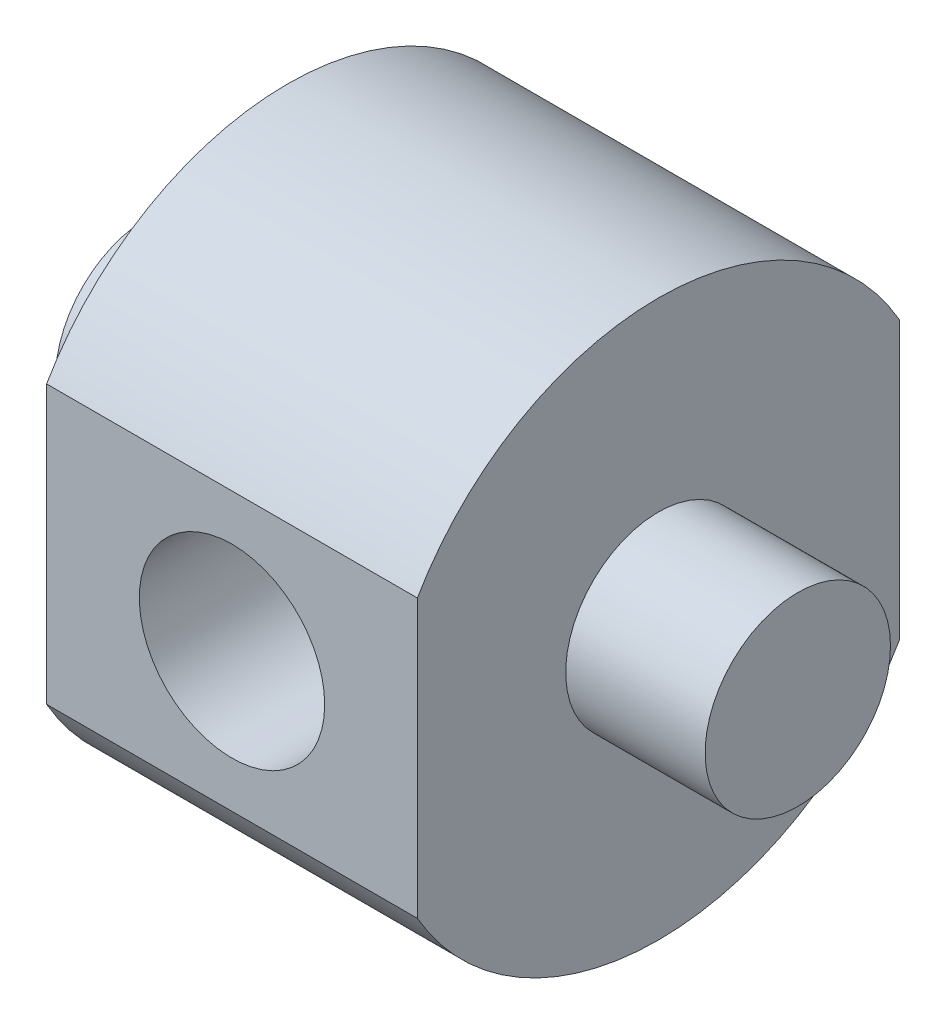
ISO-10303-21;
HEADER;
FILE_DESCRIPTION(('STEP AP214'),'2;1');
FILE_NAME('part.step','',(''),(''),'','','');
FILE_SCHEMA(('AUTOMOTIVE_DESIGN { 1 0 10303 214 1 1 1 1 }'));
ENDSEC;
DATA;
#1=APPLICATION_CONTEXT('core data for automotive mechanical design processes');
#2=APPLICATION_PROTOCOL_DEFINITION('international standard','automotive_design',2000,#1);
#3=PRODUCT_CONTEXT('',#1,'mechanical');
#4=PRODUCT('Part','Part','',(#3));
#5=PRODUCT_RELATED_PRODUCT_CATEGORY('part','',(#4));
#6=PRODUCT_DEFINITION_FORMATION('','',#4);
#7=PRODUCT_DEFINITION_CONTEXT('part definition',#1,'design');
#8=PRODUCT_DEFINITION('design','',#6,#7);
#9=PRODUCT_DEFINITION_SHAPE('','',#8);
#10=(LENGTH_UNIT() NAMED_UNIT(*) SI_UNIT(.MILLI.,.METRE.));
#11=(NAMED_UNIT(*) PLANE_ANGLE_UNIT() SI_UNIT($,.RADIAN.));
#12=(NAMED_UNIT(*) SI_UNIT($,.STERADIAN.) SOLID_ANGLE_UNIT());
#13=UNCERTAINTY_MEASURE_WITH_UNIT(LENGTH_MEASURE(1.E-05),#10,'distance_accuracy_value','');
#14=(GEOMETRIC_REPRESENTATION_CONTEXT(3) GLOBAL_UNCERTAINTY_ASSIGNED_CONTEXT((#13)) GLOBAL_UNIT_ASSIGNED_CONTEXT((#10,
#11,#12)) REPRESENTATION_CONTEXT('',''));
#15=CARTESIAN_POINT('',(0.,0.,0.));
#16=DIRECTION('',(0.,0.,1.));
#17=DIRECTION('',(1.,0.,0.));
#18=AXIS2_PLACEMENT_3D('',#15,#16,#17);
#19=CARTESIAN_POINT('',(6.35,0.,0.));
#20=DIRECTION('',(-1.,0.,0.));
#21=DIRECTION('',(0.,0.,1.));
#22=AXIS2_PLACEMENT_3D('',#19,#20,#21);
#23=CYLINDRICAL_SURFACE('',#22,9.525);
#24=CARTESIAN_POINT('',(6.35,0.,0.));
#25=DIRECTION('',(1.,0.,0.));
#26=DIRECTION('',(0.,0.,-1.));
#27=AXIS2_PLACEMENT_3D('',#24,#25,#26);
#28=CIRCLE('',#27,9.525);
#29=CARTESIAN_POINT('',(6.35,-4.7519048812029,8.255));
#30=VERTEX_POINT('',#29);
#31=CARTESIAN_POINT('',(6.35,-4.75190488120291,-8.255));
#32=VERTEX_POINT('',#31);
#33=EDGE_CURVE('E100',#30,#32,#28,.T.);
#34=ORIENTED_EDGE('',*,*,#33,.F.);
#35=DIRECTION('',(-1.,0.,0.));
#36=VECTOR('',#35,1.);
#37=CARTESIAN_POINT('',(6.35,-4.7519048812029,8.255));
#38=LINE('',#37,#36);
#39=CARTESIAN_POINT('',(-6.35,-4.7519048812029,8.255));
#40=VERTEX_POINT('',#39);
#41=EDGE_CURVE('E127',#30,#40,#38,.T.);
#42=ORIENTED_EDGE('',*,*,#41,.T.);
#43=CARTESIAN_POINT('',(-6.35,0.,0.));
#44=DIRECTION('',(1.,0.,0.));
#45=DIRECTION('',(0.,0.,-1.));
#46=AXIS2_PLACEMENT_3D('',#43,#44,#45);
#47=CIRCLE('',#46,9.525);
#48=CARTESIAN_POINT('',(-6.35,-4.75190488120291,-8.255));
#49=VERTEX_POINT('',#48);
#50=EDGE_CURVE('E101',#40,#49,#47,.T.);
#51=ORIENTED_EDGE('',*,*,#50,.T.);
#52=DIRECTION('',(-1.,0.,0.));
#53=VECTOR('',#52,1.);
#54=CARTESIAN_POINT('',(6.35,-4.75190488120291,-8.255));
#55=LINE('',#54,#53);
#56=EDGE_CURVE('E56',#49,#32,#55,.F.);
#57=ORIENTED_EDGE('',*,*,#56,.T.);
#58=EDGE_LOOP('',(#34,#42,#51,#57));
#59=FACE_BOUND('',#58,.T.);
#60=ADVANCED_FACE('F39',(#59),#23,.T.);
#61=CARTESIAN_POINT('',(-6.35,4.75190488120291,-8.255));
#62=VERTEX_POINT('',#61);
#63=CARTESIAN_POINT('',(-6.35,4.7519048812029,8.255));
#64=VERTEX_POINT('',#63);
#65=EDGE_CURVE('E92',#62,#64,#47,.T.);
#66=ORIENTED_EDGE('',*,*,#65,.T.);
#67=DIRECTION('',(-1.,0.,0.));
#68=VECTOR('',#67,1.);
#69=CARTESIAN_POINT('',(6.35,4.7519048812029,8.255));
#70=LINE('',#69,#68);
#71=CARTESIAN_POINT('',(6.35,4.7519048812029,8.255));
#72=VERTEX_POINT('',#71);
#73=EDGE_CURVE('E64',#64,#72,#70,.F.);
#74=ORIENTED_EDGE('',*,*,#73,.T.);
#75=CARTESIAN_POINT('',(6.35,4.75190488120291,-8.255));
#76=VERTEX_POINT('',#75);
#77=EDGE_CURVE('E94',#76,#72,#28,.T.);
#78=ORIENTED_EDGE('',*,*,#77,.F.);
#79=DIRECTION('',(-1.,0.,0.));
#80=VECTOR('',#79,1.);
#81=CARTESIAN_POINT('',(6.35,4.75190488120291,-8.255));
#82=LINE('',#81,#80);
#83=EDGE_CURVE('E80',#76,#62,#82,.T.);
#84=ORIENTED_EDGE('',*,*,#83,.T.);
#85=EDGE_LOOP('',(#66,#74,#78,#84));
#86=FACE_BOUND('',#85,.T.);
#87=ADVANCED_FACE('F41',(#86),#23,.T.);
#88=CARTESIAN_POINT('',(6.35,0.,0.));
#89=DIRECTION('',(1.,0.,0.));
#90=DIRECTION('',(0.,0.,-1.));
#91=AXIS2_PLACEMENT_3D('',#88,#89,#90);
#92=PLANE('',#91);
#93=DIRECTION('',(0.,1.,0.));
#94=VECTOR('',#93,1.);
#95=CARTESIAN_POINT('',(6.35,0.,8.255));
#96=LINE('',#95,#94);
#97=EDGE_CURVE('E121',#30,#72,#96,.T.);
#98=ORIENTED_EDGE('',*,*,#97,.F.);
#99=ORIENTED_EDGE('',*,*,#33,.T.);
#100=DIRECTION('',(0.,-1.,0.));
#101=VECTOR('',#100,1.);
#102=CARTESIAN_POINT('',(6.35,0.,-8.255));
#103=LINE('',#102,#101);
#104=EDGE_CURVE('E96',#76,#32,#103,.T.);
#105=ORIENTED_EDGE('',*,*,#104,.F.);
#106=ORIENTED_EDGE('',*,*,#77,.T.);
#107=EDGE_LOOP('',(#98,#99,#105,#106));
#108=FACE_BOUND('',#107,.T.);
#109=CARTESIAN_POINT('',(6.35,0.,0.));
#110=DIRECTION('',(1.,0.,0.));
#111=DIRECTION('',(0.,0.,-1.));
#112=AXIS2_PLACEMENT_3D('',#109,#110,#111);
#113=CIRCLE('',#112,3.175);
#114=CARTESIAN_POINT('',(6.35,0.,-3.175));
#115=VERTEX_POINT('',#114);
#116=EDGE_CURVE('E87',#115,#115,#113,.T.);
#117=ORIENTED_EDGE('',*,*,#116,.F.);
#118=EDGE_LOOP('',(#117));
#119=FACE_BOUND('',#118,.T.);
#120=ADVANCED_FACE('F161',(#108,#119),#92,.T.);
#121=CARTESIAN_POINT('',(-6.35,0.,0.));
#122=DIRECTION('',(1.,0.,0.));
#123=DIRECTION('',(0.,0.,-1.));
#124=AXIS2_PLACEMENT_3D('',#121,#122,#123);
#125=PLANE('',#124);
#126=CARTESIAN_POINT('',(-6.35,0.,0.));
#127=DIRECTION('',(1.,0.,0.));
#128=DIRECTION('',(0.,0.,-1.));
#129=AXIS2_PLACEMENT_3D('',#126,#127,#128);
#130=CIRCLE('',#129,3.175);
#131=CARTESIAN_POINT('',(-6.35,0.,-3.175));
#132=VERTEX_POINT('',#131);
#133=EDGE_CURVE('E117',#132,#132,#130,.T.);
#134=ORIENTED_EDGE('',*,*,#133,.T.);
#135=EDGE_LOOP('',(#134));
#136=FACE_BOUND('',#135,.T.);
#137=ORIENTED_EDGE('',*,*,#50,.F.);
#138=DIRECTION('',(0.,1.,0.));
#139=VECTOR('',#138,1.);
#140=CARTESIAN_POINT('',(-6.35,0.,8.255));
#141=LINE('',#140,#139);
#142=EDGE_CURVE('E11',#40,#64,#141,.T.);
#143=ORIENTED_EDGE('',*,*,#142,.T.);
#144=ORIENTED_EDGE('',*,*,#65,.F.);
#145=DIRECTION('',(0.,-1.,0.));
#146=VECTOR('',#145,1.);
#147=CARTESIAN_POINT('',(-6.35,0.,-8.255));
#148=LINE('',#147,#146);
#149=EDGE_CURVE('E49',#62,#49,#148,.T.);
#150=ORIENTED_EDGE('',*,*,#149,.T.);
#151=EDGE_LOOP('',(#137,#143,#144,#150));
#152=FACE_BOUND('',#151,.T.);
#153=ADVANCED_FACE('F98',(#136,#152),#125,.F.);
#154=CARTESIAN_POINT('',(11.1252,0.,0.));
#155=DIRECTION('',(-1.,0.,0.));
#156=DIRECTION('',(0.,0.,1.));
#157=AXIS2_PLACEMENT_3D('',#154,#155,#156);
#158=CYLINDRICAL_SURFACE('',#157,3.175);
#159=CARTESIAN_POINT('',(11.1252,0.,0.));
#160=DIRECTION('',(1.,0.,0.));
#161=DIRECTION('',(0.,0.,-1.));
#162=AXIS2_PLACEMENT_3D('',#159,#160,#161);
#163=CIRCLE('',#162,3.175);
#164=CARTESIAN_POINT('',(11.1252,0.,-3.175));
#165=VERTEX_POINT('',#164);
#166=EDGE_CURVE('E107',#165,#165,#163,.T.);
#167=ORIENTED_EDGE('',*,*,#166,.F.);
#168=EDGE_LOOP('',(#167));
#169=FACE_BOUND('',#168,.T.);
#170=ORIENTED_EDGE('',*,*,#116,.T.);
#171=EDGE_LOOP('',(#170));
#172=FACE_BOUND('',#171,.T.);
#173=ADVANCED_FACE('F170',(#169,#172),#158,.T.);
#174=CARTESIAN_POINT('',(11.1252,0.,0.));
#175=DIRECTION('',(1.,0.,0.));
#176=DIRECTION('',(0.,0.,-1.));
#177=AXIS2_PLACEMENT_3D('',#174,#175,#176);
#178=PLANE('',#177);
#179=ORIENTED_EDGE('',*,*,#166,.T.);
#180=EDGE_LOOP('',(#179));
#181=FACE_BOUND('',#180,.T.);
#182=ADVANCED_FACE('F172',(#181),#178,.T.);
#183=CARTESIAN_POINT('',(-11.1252,0.,0.));
#184=DIRECTION('',(1.,0.,0.));
#185=DIRECTION('',(0.,0.,-1.));
#186=AXIS2_PLACEMENT_3D('',#183,#184,#185);
#187=CYLINDRICAL_SURFACE('',#186,3.175);
#188=CARTESIAN_POINT('',(-11.1252,0.,0.));
#189=DIRECTION('',(1.,0.,0.));
#190=DIRECTION('',(0.,0.,-1.));
#191=AXIS2_PLACEMENT_3D('',#188,#189,#190);
#192=CIRCLE('',#191,3.175);
#193=CARTESIAN_POINT('',(-11.1252,0.,-3.175));
#194=VERTEX_POINT('',#193);
#195=EDGE_CURVE('E116',#194,#194,#192,.T.);
#196=ORIENTED_EDGE('',*,*,#195,.T.);
#197=EDGE_LOOP('',(#196));
#198=FACE_BOUND('',#197,.T.);
#199=ORIENTED_EDGE('',*,*,#133,.F.);
#200=EDGE_LOOP('',(#199));
#201=FACE_BOUND('',#200,.T.);
#202=ADVANCED_FACE('F179',(#198,#201),#187,.T.);
#203=CARTESIAN_POINT('',(-11.1252,0.,0.));
#204=DIRECTION('',(-1.,0.,0.));
#205=DIRECTION('',(0.,0.,-1.));
#206=AXIS2_PLACEMENT_3D('',#203,#204,#205);
#207=PLANE('',#206);
#208=ORIENTED_EDGE('',*,*,#195,.F.);
#209=EDGE_LOOP('',(#208));
#210=FACE_BOUND('',#209,.T.);
#211=ADVANCED_FACE('F187',(#210),#207,.T.);
#212=CARTESIAN_POINT('',(-11.1252,9.14538698711366,-8.255));
#213=DIRECTION('',(0.,0.,1.));
#214=DIRECTION('',(0.,-1.,0.));
#215=AXIS2_PLACEMENT_3D('',#212,#213,#214);
#216=PLANE('',#215);
#217=CARTESIAN_POINT('',(0.,0.,-8.255));
#218=DIRECTION('',(0.,0.,1.));
#219=DIRECTION('',(1.,0.,0.));
#220=AXIS2_PLACEMENT_3D('',#217,#218,#219);
#221=CIRCLE('',#220,3.175);
#222=CARTESIAN_POINT('',(3.175,0.,-8.255));
#223=VERTEX_POINT('',#222);
#224=EDGE_CURVE('E137',#223,#223,#221,.T.);
#225=ORIENTED_EDGE('',*,*,#224,.T.);
#226=EDGE_LOOP('',(#225));
#227=FACE_BOUND('',#226,.T.);
#228=ORIENTED_EDGE('',*,*,#104,.T.);
#229=ORIENTED_EDGE('',*,*,#56,.F.);
#230=ORIENTED_EDGE('',*,*,#149,.F.);
#231=ORIENTED_EDGE('',*,*,#83,.F.);
#232=EDGE_LOOP('',(#228,#229,#230,#231));
#233=FACE_BOUND('',#232,.T.);
#234=ADVANCED_FACE('F79',(#227,#233),#216,.F.);
#235=CARTESIAN_POINT('',(-11.1252,9.49956518301846,8.255));
#236=DIRECTION('',(0.,0.,-1.));
#237=DIRECTION('',(0.,1.,0.));
#238=AXIS2_PLACEMENT_3D('',#235,#236,#237);
#239=PLANE('',#238);
#240=CARTESIAN_POINT('',(0.,0.,8.255));
#241=DIRECTION('',(0.,0.,-1.));
#242=DIRECTION('',(0.,1.,0.));
#243=AXIS2_PLACEMENT_3D('',#240,#241,#242);
#244=CIRCLE('',#243,3.175);
#245=CARTESIAN_POINT('',(0.,3.175,8.255));
#246=VERTEX_POINT('',#245);
#247=EDGE_CURVE('E43',#246,#246,#244,.T.);
#248=ORIENTED_EDGE('',*,*,#247,.T.);
#249=EDGE_LOOP('',(#248));
#250=FACE_BOUND('',#249,.T.);
#251=ORIENTED_EDGE('',*,*,#97,.T.);
#252=ORIENTED_EDGE('',*,*,#73,.F.);
#253=ORIENTED_EDGE('',*,*,#142,.F.);
#254=ORIENTED_EDGE('',*,*,#41,.F.);
#255=EDGE_LOOP('',(#251,#252,#253,#254));
#256=FACE_BOUND('',#255,.T.);
#257=ADVANCED_FACE('F146',(#250,#256),#239,.F.);
#258=CARTESIAN_POINT('',(0.,0.,-8.255));
#259=DIRECTION('',(0.,0.,1.));
#260=DIRECTION('',(1.,0.,0.));
#261=AXIS2_PLACEMENT_3D('',#258,#259,#260);
#262=CYLINDRICAL_SURFACE('',#261,3.175);
#263=ORIENTED_EDGE('',*,*,#224,.F.);
#264=EDGE_LOOP('',(#263));
#265=FACE_BOUND('',#264,.T.);
#266=ORIENTED_EDGE('',*,*,#247,.F.);
#267=EDGE_LOOP('',(#266));
#268=FACE_BOUND('',#267,.T.);
#269=ADVANCED_FACE('F148',(#265,#268),#262,.F.);
#270=CLOSED_SHELL('',(#60,#87,#120,#153,#173,#182,#202,#211,#234,#257,#269));
#271=MANIFOLD_SOLID_BREP('B2',#270);
#272=ADVANCED_BREP_SHAPE_REPRESENTATION('',(#18,#271),#14);
#273=SHAPE_DEFINITION_REPRESENTATION(#9,#272);
ENDSEC;
END-ISO-10303-21;
